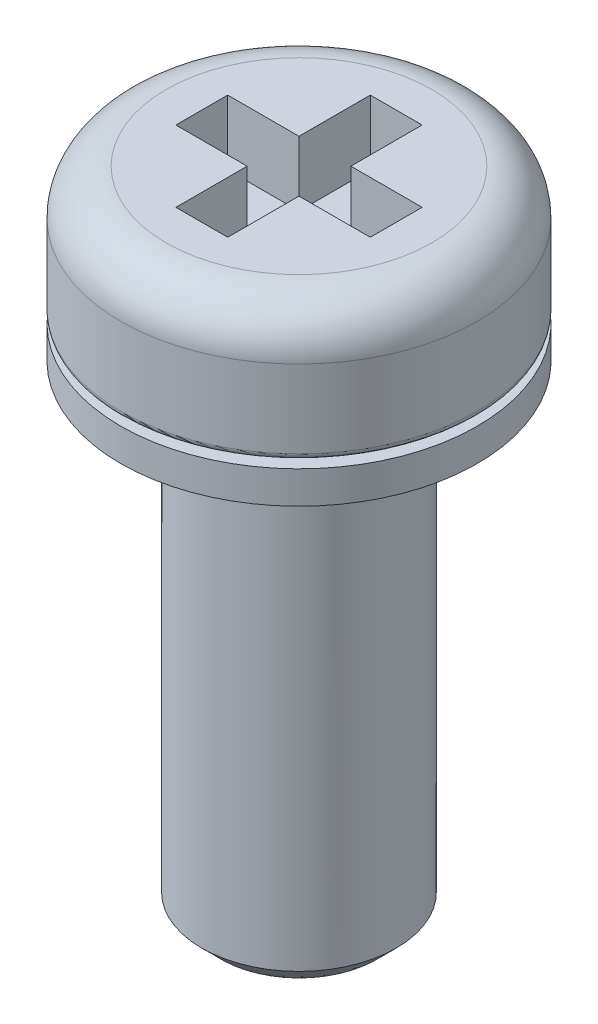
ISO-10303-21;
HEADER;
FILE_DESCRIPTION(('STEP AP214'),'2;1');
FILE_NAME('part.step','',(''),(''),'','','');
FILE_SCHEMA(('AUTOMOTIVE_DESIGN { 1 0 10303 214 1 1 1 1 }'));
ENDSEC;
DATA;
#1=APPLICATION_CONTEXT('core data for automotive mechanical design processes');
#2=APPLICATION_PROTOCOL_DEFINITION('international standard','automotive_design',2000,#1);
#3=PRODUCT_CONTEXT('',#1,'mechanical');
#4=PRODUCT('Part','Part','',(#3));
#5=PRODUCT_RELATED_PRODUCT_CATEGORY('part','',(#4));
#6=PRODUCT_DEFINITION_FORMATION('','',#4);
#7=PRODUCT_DEFINITION_CONTEXT('part definition',#1,'design');
#8=PRODUCT_DEFINITION('design','',#6,#7);
#9=PRODUCT_DEFINITION_SHAPE('','',#8);
#10=(LENGTH_UNIT() NAMED_UNIT(*) SI_UNIT(.MILLI.,.METRE.));
#11=(NAMED_UNIT(*) PLANE_ANGLE_UNIT() SI_UNIT($,.RADIAN.));
#12=(NAMED_UNIT(*) SI_UNIT($,.STERADIAN.) SOLID_ANGLE_UNIT());
#13=UNCERTAINTY_MEASURE_WITH_UNIT(LENGTH_MEASURE(1.E-05),#10,'distance_accuracy_value','');
#14=(GEOMETRIC_REPRESENTATION_CONTEXT(3) GLOBAL_UNCERTAINTY_ASSIGNED_CONTEXT((#13)) GLOBAL_UNIT_ASSIGNED_CONTEXT((#10,
#11,#12)) REPRESENTATION_CONTEXT('',''));
#15=CARTESIAN_POINT('',(0.,0.,0.));
#16=DIRECTION('',(0.,0.,1.));
#17=DIRECTION('',(1.,0.,0.));
#18=AXIS2_PLACEMENT_3D('',#15,#16,#17);
#19=CARTESIAN_POINT('',(-33.248,-7.4,44.74955299476));
#20=DIRECTION('',(0.,1.,0.));
#21=DIRECTION('',(1.,0.,0.));
#22=AXIS2_PLACEMENT_3D('',#19,#20,#21);
#23=PLANE('',#22);
#24=CARTESIAN_POINT('',(-32.,-7.40000000005466,43.5));
#25=DIRECTION('',(0.,1.,0.));
#26=DIRECTION('',(-1.,0.,0.));
#27=AXIS2_PLACEMENT_3D('',#24,#25,#26);
#28=CIRCLE('',#27,1.19999999995017);
#29=CARTESIAN_POINT('',(-33.1999999999502,-7.40000000005466,43.5));
#30=VERTEX_POINT('',#29);
#31=EDGE_CURVE('P0_E165',#30,#30,#28,.F.);
#32=ORIENTED_EDGE('',*,*,#31,.T.);
#33=EDGE_LOOP('',(#32));
#34=FACE_BOUND('',#33,.T.);
#35=ADVANCED_FACE('P0_F17',(#34),#23,.F.);
#36=CARTESIAN_POINT('',(-32.,-7.40000000005467,43.5));
#37=DIRECTION('',(0.,1.,0.));
#38=DIRECTION('',(-1.,0.,0.));
#39=AXIS2_PLACEMENT_3D('',#36,#37,#38);
#40=CONICAL_SURFACE('',#39,1.19999999995016,0.785398163389693);
#41=CARTESIAN_POINT('',(-32.,-7.09999999999999,43.5));
#42=DIRECTION('',(0.,1.,0.));
#43=DIRECTION('',(1.,0.,0.));
#44=AXIS2_PLACEMENT_3D('',#41,#42,#43);
#45=CIRCLE('',#44,1.5);
#46=CARTESIAN_POINT('',(-30.5,-7.09999999999999,43.5));
#47=VERTEX_POINT('',#46);
#48=EDGE_CURVE('P0_E161',#47,#47,#45,.F.);
#49=ORIENTED_EDGE('',*,*,#48,.T.);
#50=EDGE_LOOP('',(#49));
#51=FACE_BOUND('',#50,.T.);
#52=ORIENTED_EDGE('',*,*,#31,.F.);
#53=EDGE_LOOP('',(#52));
#54=FACE_BOUND('',#53,.T.);
#55=ADVANCED_FACE('P0_F537',(#51,#54),#40,.T.);
#56=CARTESIAN_POINT('',(-32.,-7.09999999999999,43.5));
#57=DIRECTION('',(0.,1.,0.));
#58=DIRECTION('',(0.,0.,1.));
#59=AXIS2_PLACEMENT_3D('',#56,#57,#58);
#60=CYLINDRICAL_SURFACE('',#59,1.5);
#61=CARTESIAN_POINT('',(-32.,3.55618312575245E-13,43.5));
#62=DIRECTION('',(0.,1.,0.));
#63=DIRECTION('',(0.,0.,1.));
#64=AXIS2_PLACEMENT_3D('',#61,#62,#63);
#65=CIRCLE('',#64,1.5);
#66=CARTESIAN_POINT('',(-32.,3.55618312575245E-13,45.));
#67=VERTEX_POINT('',#66);
#68=EDGE_CURVE('P0_E164',#67,#67,#65,.F.);
#69=ORIENTED_EDGE('',*,*,#68,.T.);
#70=EDGE_LOOP('',(#69));
#71=FACE_BOUND('',#70,.T.);
#72=ORIENTED_EDGE('',*,*,#48,.F.);
#73=EDGE_LOOP('',(#72));
#74=FACE_BOUND('',#73,.T.);
#75=ADVANCED_FACE('P0_F527',(#71,#74),#60,.T.);
#76=CARTESIAN_POINT('',(-34.86,0.,46.36));
#77=DIRECTION('',(0.,1.,0.));
#78=DIRECTION('',(1.,0.,0.));
#79=AXIS2_PLACEMENT_3D('',#76,#77,#78);
#80=PLANE('',#79);
#81=ORIENTED_EDGE('',*,*,#68,.F.);
#82=EDGE_LOOP('',(#81));
#83=FACE_BOUND('',#82,.T.);
#84=CARTESIAN_POINT('',(-32.,0.,43.5));
#85=DIRECTION('',(0.,1.,0.));
#86=DIRECTION('',(0.,0.,1.));
#87=AXIS2_PLACEMENT_3D('',#84,#85,#86);
#88=CIRCLE('',#87,2.75);
#89=CARTESIAN_POINT('',(-32.,0.,46.25));
#90=VERTEX_POINT('',#89);
#91=EDGE_CURVE('P0_E219',#90,#90,#88,.F.);
#92=ORIENTED_EDGE('',*,*,#91,.T.);
#93=EDGE_LOOP('',(#92));
#94=FACE_BOUND('',#93,.T.);
#95=ADVANCED_FACE('P0_F517',(#83,#94),#80,.F.);
#96=CARTESIAN_POINT('',(-32.,0.,43.5));
#97=DIRECTION('',(0.,1.,0.));
#98=DIRECTION('',(0.,0.,1.));
#99=AXIS2_PLACEMENT_3D('',#96,#97,#98);
#100=CYLINDRICAL_SURFACE('',#99,2.75);
#101=ORIENTED_EDGE('',*,*,#91,.F.);
#102=EDGE_LOOP('',(#101));
#103=FACE_BOUND('',#102,.T.);
#104=CARTESIAN_POINT('',(-32.,0.499999999999966,43.5));
#105=DIRECTION('',(0.,1.,0.));
#106=DIRECTION('',(0.,0.,1.));
#107=AXIS2_PLACEMENT_3D('',#104,#105,#106);
#108=CIRCLE('',#107,2.75);
#109=CARTESIAN_POINT('',(-32.,0.499999999999966,46.25));
#110=VERTEX_POINT('',#109);
#111=EDGE_CURVE('P0_E216',#110,#110,#108,.T.);
#112=ORIENTED_EDGE('',*,*,#111,.F.);
#113=EDGE_LOOP('',(#112));
#114=FACE_BOUND('',#113,.T.);
#115=ADVANCED_FACE('P0_F507',(#103,#114),#100,.T.);
#116=CARTESIAN_POINT('',(-34.86,0.5,46.36));
#117=DIRECTION('',(0.,1.,0.));
#118=DIRECTION('',(1.,0.,0.));
#119=AXIS2_PLACEMENT_3D('',#116,#117,#118);
#120=PLANE('',#119);
#121=CARTESIAN_POINT('',(-32.,0.499999999999853,43.5));
#122=DIRECTION('',(0.,1.,0.));
#123=DIRECTION('',(0.,0.,1.));
#124=AXIS2_PLACEMENT_3D('',#121,#122,#123);
#125=CIRCLE('',#124,1.5);
#126=CARTESIAN_POINT('',(-32.,0.499999999999853,45.));
#127=VERTEX_POINT('',#126);
#128=EDGE_CURVE('P0_E143',#127,#127,#125,.F.);
#129=ORIENTED_EDGE('',*,*,#128,.T.);
#130=EDGE_LOOP('',(#129));
#131=FACE_BOUND('',#130,.T.);
#132=ORIENTED_EDGE('',*,*,#111,.T.);
#133=EDGE_LOOP('',(#132));
#134=FACE_BOUND('',#133,.T.);
#135=ADVANCED_FACE('P0_F498',(#131,#134),#120,.T.);
#136=CARTESIAN_POINT('',(-30.44,1.6,45.06));
#137=DIRECTION('',(0.,1.,0.));
#138=DIRECTION('',(0.,0.,-1.));
#139=AXIS2_PLACEMENT_3D('',#136,#137,#138);
#140=PLANE('',#139);
#141=DIRECTION('',(-1.,0.,0.));
#142=VECTOR('',#141,1.);
#143=CARTESIAN_POINT('',(-32.95,1.6,43.1));
#144=LINE('',#143,#142);
#145=CARTESIAN_POINT('',(-32.4,1.6,43.1));
#146=VERTEX_POINT('',#145);
#147=CARTESIAN_POINT('',(-33.5,1.6,43.1));
#148=VERTEX_POINT('',#147);
#149=EDGE_CURVE('P0_E150',#146,#148,#144,.T.);
#150=ORIENTED_EDGE('',*,*,#149,.T.);
#151=DIRECTION('',(0.,0.,1.));
#152=VECTOR('',#151,1.);
#153=CARTESIAN_POINT('',(-33.5,1.6,43.5));
#154=LINE('',#153,#152);
#155=CARTESIAN_POINT('',(-33.5,1.6,43.9));
#156=VERTEX_POINT('',#155);
#157=EDGE_CURVE('P0_E142',#148,#156,#154,.T.);
#158=ORIENTED_EDGE('',*,*,#157,.T.);
#159=DIRECTION('',(1.,0.,0.));
#160=VECTOR('',#159,1.);
#161=CARTESIAN_POINT('',(-32.95,1.6,43.9));
#162=LINE('',#161,#160);
#163=CARTESIAN_POINT('',(-32.4,1.6,43.9));
#164=VERTEX_POINT('',#163);
#165=EDGE_CURVE('P0_E131',#156,#164,#162,.T.);
#166=ORIENTED_EDGE('',*,*,#165,.T.);
#167=DIRECTION('',(0.,0.,1.));
#168=VECTOR('',#167,1.);
#169=CARTESIAN_POINT('',(-32.4,1.6,44.45));
#170=LINE('',#169,#168);
#171=CARTESIAN_POINT('',(-32.4,1.6,45.));
#172=VERTEX_POINT('',#171);
#173=EDGE_CURVE('P0_E290',#164,#172,#170,.T.);
#174=ORIENTED_EDGE('',*,*,#173,.T.);
#175=DIRECTION('',(1.,0.,0.));
#176=VECTOR('',#175,1.);
#177=CARTESIAN_POINT('',(-32.,1.6,45.));
#178=LINE('',#177,#176);
#179=CARTESIAN_POINT('',(-31.6,1.6,45.));
#180=VERTEX_POINT('',#179);
#181=EDGE_CURVE('P0_E296',#172,#180,#178,.T.);
#182=ORIENTED_EDGE('',*,*,#181,.T.);
#183=DIRECTION('',(0.,0.,-1.));
#184=VECTOR('',#183,1.);
#185=CARTESIAN_POINT('',(-31.6,1.6,44.45));
#186=LINE('',#185,#184);
#187=CARTESIAN_POINT('',(-31.6,1.6,43.9));
#188=VERTEX_POINT('',#187);
#189=EDGE_CURVE('P0_E302',#180,#188,#186,.T.);
#190=ORIENTED_EDGE('',*,*,#189,.T.);
#191=DIRECTION('',(1.,0.,0.));
#192=VECTOR('',#191,1.);
#193=CARTESIAN_POINT('',(-31.05,1.6,43.9));
#194=LINE('',#193,#192);
#195=CARTESIAN_POINT('',(-30.5,1.6,43.9));
#196=VERTEX_POINT('',#195);
#197=EDGE_CURVE('P0_E308',#188,#196,#194,.T.);
#198=ORIENTED_EDGE('',*,*,#197,.T.);
#199=DIRECTION('',(0.,0.,-1.));
#200=VECTOR('',#199,1.);
#201=CARTESIAN_POINT('',(-30.5,1.6,43.5));
#202=LINE('',#201,#200);
#203=CARTESIAN_POINT('',(-30.5,1.6,43.1));
#204=VERTEX_POINT('',#203);
#205=EDGE_CURVE('P0_E314',#196,#204,#202,.T.);
#206=ORIENTED_EDGE('',*,*,#205,.T.);
#207=DIRECTION('',(-1.,0.,0.));
#208=VECTOR('',#207,1.);
#209=CARTESIAN_POINT('',(-31.05,1.6,43.1));
#210=LINE('',#209,#208);
#211=CARTESIAN_POINT('',(-31.6,1.6,43.1));
#212=VERTEX_POINT('',#211);
#213=EDGE_CURVE('P0_E320',#204,#212,#210,.T.);
#214=ORIENTED_EDGE('',*,*,#213,.T.);
#215=DIRECTION('',(0.,0.,-1.));
#216=VECTOR('',#215,1.);
#217=CARTESIAN_POINT('',(-31.6,1.6,42.55));
#218=LINE('',#217,#216);
#219=CARTESIAN_POINT('',(-31.6,1.6,42.));
#220=VERTEX_POINT('',#219);
#221=EDGE_CURVE('P0_E326',#212,#220,#218,.T.);
#222=ORIENTED_EDGE('',*,*,#221,.T.);
#223=DIRECTION('',(-1.,0.,0.));
#224=VECTOR('',#223,1.);
#225=CARTESIAN_POINT('',(-32.,1.6,42.));
#226=LINE('',#225,#224);
#227=CARTESIAN_POINT('',(-32.4,1.6,42.));
#228=VERTEX_POINT('',#227);
#229=EDGE_CURVE('P0_E332',#220,#228,#226,.T.);
#230=ORIENTED_EDGE('',*,*,#229,.T.);
#231=DIRECTION('',(0.,0.,1.));
#232=VECTOR('',#231,1.);
#233=CARTESIAN_POINT('',(-32.4,1.6,42.55));
#234=LINE('',#233,#232);
#235=EDGE_CURVE('P0_E338',#228,#146,#234,.T.);
#236=ORIENTED_EDGE('',*,*,#235,.T.);
#237=EDGE_LOOP('',(#150,#158,#166,#174,#182,#190,#198,#206,#214,#222,#230,#236));
#238=FACE_BOUND('',#237,.T.);
#239=ADVANCED_FACE('P0_F153',(#238),#140,.T.);
#240=CARTESIAN_POINT('',(-32.,0.499999999999853,43.5));
#241=DIRECTION('',(0.,1.,0.));
#242=DIRECTION('',(0.,0.,1.));
#243=AXIS2_PLACEMENT_3D('',#240,#241,#242);
#244=CYLINDRICAL_SURFACE('',#243,1.5);
#245=CARTESIAN_POINT('',(-32.,0.599999999999755,43.5));
#246=DIRECTION('',(0.,1.,0.));
#247=DIRECTION('',(0.,0.,1.));
#248=AXIS2_PLACEMENT_3D('',#245,#246,#247);
#249=CIRCLE('',#248,1.5);
#250=CARTESIAN_POINT('',(-32.,0.599999999999755,45.));
#251=VERTEX_POINT('',#250);
#252=EDGE_CURVE('P0_E206',#251,#251,#249,.F.);
#253=ORIENTED_EDGE('',*,*,#252,.T.);
#254=EDGE_LOOP('',(#253));
#255=FACE_BOUND('',#254,.T.);
#256=ORIENTED_EDGE('',*,*,#128,.F.);
#257=EDGE_LOOP('',(#256));
#258=FACE_BOUND('',#257,.T.);
#259=ADVANCED_FACE('P0_F481',(#255,#258),#244,.T.);
#260=CARTESIAN_POINT('',(-33.522,1.58,43.9));
#261=DIRECTION('',(0.,0.,1.));
#262=DIRECTION('',(1.,0.,0.));
#263=AXIS2_PLACEMENT_3D('',#260,#261,#262);
#264=PLANE('',#263);
#265=ORIENTED_EDGE('',*,*,#165,.F.);
#266=DIRECTION('',(0.,1.,0.));
#267=VECTOR('',#266,1.);
#268=CARTESIAN_POINT('',(-33.5,2.1,43.9));
#269=LINE('',#268,#267);
#270=CARTESIAN_POINT('',(-33.5,2.6,43.9));
#271=VERTEX_POINT('',#270);
#272=EDGE_CURVE('P0_E135',#156,#271,#269,.T.);
#273=ORIENTED_EDGE('',*,*,#272,.T.);
#274=DIRECTION('',(-1.,0.,0.));
#275=VECTOR('',#274,1.);
#276=CARTESIAN_POINT('',(-32.,2.6,43.9000000000002));
#277=LINE('',#276,#275);
#278=CARTESIAN_POINT('',(-32.4,2.6,43.9));
#279=VERTEX_POINT('',#278);
#280=EDGE_CURVE('P0_E269',#279,#271,#277,.T.);
#281=ORIENTED_EDGE('',*,*,#280,.F.);
#282=DIRECTION('',(0.,-1.,0.));
#283=VECTOR('',#282,1.);
#284=CARTESIAN_POINT('',(-32.4,2.1,43.9));
#285=LINE('',#284,#283);
#286=EDGE_CURVE('P0_E137',#279,#164,#285,.T.);
#287=ORIENTED_EDGE('',*,*,#286,.T.);
#288=EDGE_LOOP('',(#265,#273,#281,#287));
#289=FACE_BOUND('',#288,.T.);
#290=ADVANCED_FACE('P0_F133',(#289),#264,.F.);
#291=CARTESIAN_POINT('',(-33.5,1.58,43.084));
#292=DIRECTION('',(-1.,0.,0.));
#293=DIRECTION('',(0.,0.,1.));
#294=AXIS2_PLACEMENT_3D('',#291,#292,#293);
#295=PLANE('',#294);
#296=ORIENTED_EDGE('',*,*,#157,.F.);
#297=DIRECTION('',(0.,1.,0.));
#298=VECTOR('',#297,1.);
#299=CARTESIAN_POINT('',(-33.5,2.1,43.1));
#300=LINE('',#299,#298);
#301=CARTESIAN_POINT('',(-33.5,2.6,43.0999999999999));
#302=VERTEX_POINT('',#301);
#303=EDGE_CURVE('P0_E340',#148,#302,#300,.T.);
#304=ORIENTED_EDGE('',*,*,#303,.T.);
#305=DIRECTION('',(0.,0.,-1.));
#306=VECTOR('',#305,1.);
#307=CARTESIAN_POINT('',(-33.5,2.6,43.5));
#308=LINE('',#307,#306);
#309=EDGE_CURVE('P0_E149',#271,#302,#308,.T.);
#310=ORIENTED_EDGE('',*,*,#309,.F.);
#311=ORIENTED_EDGE('',*,*,#272,.F.);
#312=EDGE_LOOP('',(#296,#304,#310,#311));
#313=FACE_BOUND('',#312,.T.);
#314=ADVANCED_FACE('P0_F146',(#313),#295,.F.);
#315=CARTESIAN_POINT('',(-32.378,1.58,43.1));
#316=DIRECTION('',(0.,0.,-1.));
#317=DIRECTION('',(-1.,0.,0.));
#318=AXIS2_PLACEMENT_3D('',#315,#316,#317);
#319=PLANE('',#318);
#320=ORIENTED_EDGE('',*,*,#149,.F.);
#321=DIRECTION('',(0.,1.,0.));
#322=VECTOR('',#321,1.);
#323=CARTESIAN_POINT('',(-32.4,2.1,43.1));
#324=LINE('',#323,#322);
#325=CARTESIAN_POINT('',(-32.4,2.6,43.0999999999999));
#326=VERTEX_POINT('',#325);
#327=EDGE_CURVE('P0_E335',#146,#326,#324,.T.);
#328=ORIENTED_EDGE('',*,*,#327,.T.);
#329=DIRECTION('',(1.,0.,0.));
#330=VECTOR('',#329,1.);
#331=CARTESIAN_POINT('',(-32.,2.6,43.0999999999998));
#332=LINE('',#331,#330);
#333=EDGE_CURVE('P0_E266',#302,#326,#332,.T.);
#334=ORIENTED_EDGE('',*,*,#333,.F.);
#335=ORIENTED_EDGE('',*,*,#303,.F.);
#336=EDGE_LOOP('',(#320,#328,#334,#335));
#337=FACE_BOUND('',#336,.T.);
#338=ADVANCED_FACE('P0_F343',(#337),#319,.F.);
#339=CARTESIAN_POINT('',(-32.4,1.58,41.978));
#340=DIRECTION('',(-1.,0.,0.));
#341=DIRECTION('',(0.,0.,1.));
#342=AXIS2_PLACEMENT_3D('',#339,#340,#341);
#343=PLANE('',#342);
#344=ORIENTED_EDGE('',*,*,#235,.F.);
#345=DIRECTION('',(0.,1.,0.));
#346=VECTOR('',#345,1.);
#347=CARTESIAN_POINT('',(-32.4,2.1,42.));
#348=LINE('',#347,#346);
#349=CARTESIAN_POINT('',(-32.4,2.6,41.9999999999998));
#350=VERTEX_POINT('',#349);
#351=EDGE_CURVE('P0_E329',#228,#350,#348,.T.);
#352=ORIENTED_EDGE('',*,*,#351,.T.);
#353=DIRECTION('',(0.,0.,-1.));
#354=VECTOR('',#353,1.);
#355=CARTESIAN_POINT('',(-32.4,2.6,43.5));
#356=LINE('',#355,#354);
#357=EDGE_CURVE('P0_E264',#326,#350,#356,.T.);
#358=ORIENTED_EDGE('',*,*,#357,.F.);
#359=ORIENTED_EDGE('',*,*,#327,.F.);
#360=EDGE_LOOP('',(#344,#352,#358,#359));
#361=FACE_BOUND('',#360,.T.);
#362=ADVANCED_FACE('P0_F377',(#361),#343,.F.);
#363=CARTESIAN_POINT('',(-31.584,1.58,42.));
#364=DIRECTION('',(0.,0.,-1.));
#365=DIRECTION('',(-1.,0.,0.));
#366=AXIS2_PLACEMENT_3D('',#363,#364,#365);
#367=PLANE('',#366);
#368=ORIENTED_EDGE('',*,*,#229,.F.);
#369=DIRECTION('',(0.,1.,0.));
#370=VECTOR('',#369,1.);
#371=CARTESIAN_POINT('',(-31.6,2.1,42.));
#372=LINE('',#371,#370);
#373=CARTESIAN_POINT('',(-31.6,2.6,41.9999999999998));
#374=VERTEX_POINT('',#373);
#375=EDGE_CURVE('P0_E323',#220,#374,#372,.T.);
#376=ORIENTED_EDGE('',*,*,#375,.T.);
#377=DIRECTION('',(1.,0.,0.));
#378=VECTOR('',#377,1.);
#379=CARTESIAN_POINT('',(-32.,2.6,41.9999999999993));
#380=LINE('',#379,#378);
#381=EDGE_CURVE('P0_E262',#350,#374,#380,.T.);
#382=ORIENTED_EDGE('',*,*,#381,.F.);
#383=ORIENTED_EDGE('',*,*,#351,.F.);
#384=EDGE_LOOP('',(#368,#376,#382,#383));
#385=FACE_BOUND('',#384,.T.);
#386=ADVANCED_FACE('P0_F374',(#385),#367,.F.);
#387=CARTESIAN_POINT('',(-31.6,1.58,43.122));
#388=DIRECTION('',(1.,0.,0.));
#389=DIRECTION('',(0.,0.,-1.));
#390=AXIS2_PLACEMENT_3D('',#387,#388,#389);
#391=PLANE('',#390);
#392=ORIENTED_EDGE('',*,*,#221,.F.);
#393=DIRECTION('',(0.,1.,0.));
#394=VECTOR('',#393,1.);
#395=CARTESIAN_POINT('',(-31.6,2.1,43.1));
#396=LINE('',#395,#394);
#397=CARTESIAN_POINT('',(-31.6,2.6,43.0999999999999));
#398=VERTEX_POINT('',#397);
#399=EDGE_CURVE('P0_E317',#212,#398,#396,.T.);
#400=ORIENTED_EDGE('',*,*,#399,.T.);
#401=DIRECTION('',(0.,0.,1.));
#402=VECTOR('',#401,1.);
#403=CARTESIAN_POINT('',(-31.6,2.6,43.5));
#404=LINE('',#403,#402);
#405=EDGE_CURVE('P0_E260',#374,#398,#404,.T.);
#406=ORIENTED_EDGE('',*,*,#405,.F.);
#407=ORIENTED_EDGE('',*,*,#375,.F.);
#408=EDGE_LOOP('',(#392,#400,#406,#407));
#409=FACE_BOUND('',#408,.T.);
#410=ADVANCED_FACE('P0_F370',(#409),#391,.F.);
#411=CARTESIAN_POINT('',(-30.478,1.58,43.1));
#412=DIRECTION('',(0.,0.,-1.));
#413=DIRECTION('',(-1.,0.,0.));
#414=AXIS2_PLACEMENT_3D('',#411,#412,#413);
#415=PLANE('',#414);
#416=ORIENTED_EDGE('',*,*,#213,.F.);
#417=DIRECTION('',(0.,1.,0.));
#418=VECTOR('',#417,1.);
#419=CARTESIAN_POINT('',(-30.5,2.1,43.1));
#420=LINE('',#419,#418);
#421=CARTESIAN_POINT('',(-30.5,2.6,43.0999999999999));
#422=VERTEX_POINT('',#421);
#423=EDGE_CURVE('P0_E311',#204,#422,#420,.T.);
#424=ORIENTED_EDGE('',*,*,#423,.T.);
#425=DIRECTION('',(1.,0.,0.));
#426=VECTOR('',#425,1.);
#427=CARTESIAN_POINT('',(-32.,2.6,43.0999999999998));
#428=LINE('',#427,#426);
#429=EDGE_CURVE('P0_E258',#398,#422,#428,.T.);
#430=ORIENTED_EDGE('',*,*,#429,.F.);
#431=ORIENTED_EDGE('',*,*,#399,.F.);
#432=EDGE_LOOP('',(#416,#424,#430,#431));
#433=FACE_BOUND('',#432,.T.);
#434=ADVANCED_FACE('P0_F366',(#433),#415,.F.);
#435=CARTESIAN_POINT('',(-30.5,1.58,43.916));
#436=DIRECTION('',(1.,0.,0.));
#437=DIRECTION('',(0.,0.,-1.));
#438=AXIS2_PLACEMENT_3D('',#435,#436,#437);
#439=PLANE('',#438);
#440=ORIENTED_EDGE('',*,*,#205,.F.);
#441=DIRECTION('',(0.,1.,0.));
#442=VECTOR('',#441,1.);
#443=CARTESIAN_POINT('',(-30.5,2.1,43.9));
#444=LINE('',#443,#442);
#445=CARTESIAN_POINT('',(-30.5,2.6,43.9));
#446=VERTEX_POINT('',#445);
#447=EDGE_CURVE('P0_E305',#196,#446,#444,.T.);
#448=ORIENTED_EDGE('',*,*,#447,.T.);
#449=DIRECTION('',(0.,0.,1.));
#450=VECTOR('',#449,1.);
#451=CARTESIAN_POINT('',(-30.5,2.6,43.5));
#452=LINE('',#451,#450);
#453=EDGE_CURVE('P0_E256',#422,#446,#452,.T.);
#454=ORIENTED_EDGE('',*,*,#453,.F.);
#455=ORIENTED_EDGE('',*,*,#423,.F.);
#456=EDGE_LOOP('',(#440,#448,#454,#455));
#457=FACE_BOUND('',#456,.T.);
#458=ADVANCED_FACE('P0_F362',(#457),#439,.F.);
#459=CARTESIAN_POINT('',(-31.622,1.58,43.9));
#460=DIRECTION('',(0.,0.,1.));
#461=DIRECTION('',(1.,0.,0.));
#462=AXIS2_PLACEMENT_3D('',#459,#460,#461);
#463=PLANE('',#462);
#464=ORIENTED_EDGE('',*,*,#197,.F.);
#465=DIRECTION('',(0.,1.,0.));
#466=VECTOR('',#465,1.);
#467=CARTESIAN_POINT('',(-31.6,2.1,43.9));
#468=LINE('',#467,#466);
#469=CARTESIAN_POINT('',(-31.6,2.6,43.9));
#470=VERTEX_POINT('',#469);
#471=EDGE_CURVE('P0_E299',#188,#470,#468,.T.);
#472=ORIENTED_EDGE('',*,*,#471,.T.);
#473=DIRECTION('',(-1.,0.,0.));
#474=VECTOR('',#473,1.);
#475=CARTESIAN_POINT('',(-32.,2.6,43.9000000000002));
#476=LINE('',#475,#474);
#477=EDGE_CURVE('P0_E254',#446,#470,#476,.T.);
#478=ORIENTED_EDGE('',*,*,#477,.F.);
#479=ORIENTED_EDGE('',*,*,#447,.F.);
#480=EDGE_LOOP('',(#464,#472,#478,#479));
#481=FACE_BOUND('',#480,.T.);
#482=ADVANCED_FACE('P0_F358',(#481),#463,.F.);
#483=CARTESIAN_POINT('',(-31.6,1.58,45.022));
#484=DIRECTION('',(1.,0.,0.));
#485=DIRECTION('',(0.,0.,-1.));
#486=AXIS2_PLACEMENT_3D('',#483,#484,#485);
#487=PLANE('',#486);
#488=ORIENTED_EDGE('',*,*,#189,.F.);
#489=DIRECTION('',(0.,1.,0.));
#490=VECTOR('',#489,1.);
#491=CARTESIAN_POINT('',(-31.6,2.1,45.));
#492=LINE('',#491,#490);
#493=CARTESIAN_POINT('',(-31.6,2.6,45.0000000000002));
#494=VERTEX_POINT('',#493);
#495=EDGE_CURVE('P0_E293',#180,#494,#492,.T.);
#496=ORIENTED_EDGE('',*,*,#495,.T.);
#497=DIRECTION('',(0.,0.,1.));
#498=VECTOR('',#497,1.);
#499=CARTESIAN_POINT('',(-31.6,2.6,43.5));
#500=LINE('',#499,#498);
#501=EDGE_CURVE('P0_E252',#470,#494,#500,.T.);
#502=ORIENTED_EDGE('',*,*,#501,.F.);
#503=ORIENTED_EDGE('',*,*,#471,.F.);
#504=EDGE_LOOP('',(#488,#496,#502,#503));
#505=FACE_BOUND('',#504,.T.);
#506=ADVANCED_FACE('P0_F354',(#505),#487,.F.);
#507=CARTESIAN_POINT('',(-32.416,1.58,45.));
#508=DIRECTION('',(0.,0.,1.));
#509=DIRECTION('',(1.,0.,0.));
#510=AXIS2_PLACEMENT_3D('',#507,#508,#509);
#511=PLANE('',#510);
#512=ORIENTED_EDGE('',*,*,#181,.F.);
#513=DIRECTION('',(0.,1.,0.));
#514=VECTOR('',#513,1.);
#515=CARTESIAN_POINT('',(-32.4,2.1,45.));
#516=LINE('',#515,#514);
#517=CARTESIAN_POINT('',(-32.4,2.6,45.0000000000002));
#518=VERTEX_POINT('',#517);
#519=EDGE_CURVE('P0_E283',#172,#518,#516,.T.);
#520=ORIENTED_EDGE('',*,*,#519,.T.);
#521=DIRECTION('',(-1.,0.,0.));
#522=VECTOR('',#521,1.);
#523=CARTESIAN_POINT('',(-32.,2.6,45.0000000000007));
#524=LINE('',#523,#522);
#525=EDGE_CURVE('P0_E60',#494,#518,#524,.T.);
#526=ORIENTED_EDGE('',*,*,#525,.F.);
#527=ORIENTED_EDGE('',*,*,#495,.F.);
#528=EDGE_LOOP('',(#512,#520,#526,#527));
#529=FACE_BOUND('',#528,.T.);
#530=ADVANCED_FACE('P0_F351',(#529),#511,.F.);
#531=CARTESIAN_POINT('',(-32.4,1.58,43.878));
#532=DIRECTION('',(-1.,0.,0.));
#533=DIRECTION('',(0.,0.,1.));
#534=AXIS2_PLACEMENT_3D('',#531,#532,#533);
#535=PLANE('',#534);
#536=ORIENTED_EDGE('',*,*,#173,.F.);
#537=ORIENTED_EDGE('',*,*,#286,.F.);
#538=DIRECTION('',(0.,0.,-1.));
#539=VECTOR('',#538,1.);
#540=CARTESIAN_POINT('',(-32.4,2.6,43.5));
#541=LINE('',#540,#539);
#542=EDGE_CURVE('P0_E249',#518,#279,#541,.T.);
#543=ORIENTED_EDGE('',*,*,#542,.F.);
#544=ORIENTED_EDGE('',*,*,#519,.F.);
#545=EDGE_LOOP('',(#536,#537,#543,#544));
#546=FACE_BOUND('',#545,.T.);
#547=ADVANCED_FACE('P0_F180',(#546),#535,.F.);
#548=CARTESIAN_POINT('',(-34.756,0.6,46.256));
#549=DIRECTION('',(0.,1.,0.));
#550=DIRECTION('',(1.,0.,0.));
#551=AXIS2_PLACEMENT_3D('',#548,#549,#550);
#552=PLANE('',#551);
#553=ORIENTED_EDGE('',*,*,#252,.F.);
#554=EDGE_LOOP('',(#553));
#555=FACE_BOUND('',#554,.T.);
#556=CARTESIAN_POINT('',(-32.,0.6,43.5));
#557=DIRECTION('',(0.,1.,0.));
#558=DIRECTION('',(-1.,0.,-2.43515899269084E-13));
#559=AXIS2_PLACEMENT_3D('',#556,#557,#558);
#560=CIRCLE('',#559,2.65000000000123);
#561=CARTESIAN_POINT('',(-29.3499999999993,0.6,43.5000000000003));
#562=VERTEX_POINT('',#561);
#563=CARTESIAN_POINT('',(-34.6500000000007,0.6,43.4999999999999));
#564=VERTEX_POINT('',#563);
#565=EDGE_CURVE('P0_E167',#562,#564,#560,.F.);
#566=ORIENTED_EDGE('',*,*,#565,.T.);
#567=CARTESIAN_POINT('',(-32.,0.6,43.5));
#568=DIRECTION('',(0.,1.,0.));
#569=DIRECTION('',(1.,0.,2.48752800328634E-13));
#570=AXIS2_PLACEMENT_3D('',#567,#568,#569);
#571=CIRCLE('',#570,2.65000000000123);
#572=EDGE_CURVE('P0_E48',#562,#564,#571,.T.);
#573=ORIENTED_EDGE('',*,*,#572,.F.);
#574=EDGE_LOOP('',(#566,#573));
#575=FACE_BOUND('',#574,.T.);
#576=ADVANCED_FACE('P0_F171',(#555,#575),#552,.F.);
#577=CARTESIAN_POINT('',(-34.132,2.6,45.63413563585));
#578=DIRECTION('',(0.,1.,0.));
#579=DIRECTION('',(1.,0.,0.));
#580=AXIS2_PLACEMENT_3D('',#577,#578,#579);
#581=PLANE('',#580);
#582=ORIENTED_EDGE('',*,*,#525,.T.);
#583=ORIENTED_EDGE('',*,*,#542,.T.);
#584=ORIENTED_EDGE('',*,*,#280,.T.);
#585=ORIENTED_EDGE('',*,*,#309,.T.);
#586=ORIENTED_EDGE('',*,*,#333,.T.);
#587=ORIENTED_EDGE('',*,*,#357,.T.);
#588=ORIENTED_EDGE('',*,*,#381,.T.);
#589=ORIENTED_EDGE('',*,*,#405,.T.);
#590=ORIENTED_EDGE('',*,*,#429,.T.);
#591=ORIENTED_EDGE('',*,*,#453,.T.);
#592=ORIENTED_EDGE('',*,*,#477,.T.);
#593=ORIENTED_EDGE('',*,*,#501,.T.);
#594=EDGE_LOOP('',(#582,#583,#584,#585,#586,#587,#588,#589,#590,#591,#592,#593));
#595=FACE_BOUND('',#594,.T.);
#596=CARTESIAN_POINT('',(-32.,2.6,43.5));
#597=DIRECTION('',(0.,-1.,0.));
#598=DIRECTION('',(-1.,0.,2.40661149545627E-12));
#599=AXIS2_PLACEMENT_3D('',#596,#597,#598);
#600=CIRCLE('',#599,2.04999999999696);
#601=CARTESIAN_POINT('',(-29.9500000000018,2.6,43.4999999999972));
#602=VERTEX_POINT('',#601);
#603=CARTESIAN_POINT('',(-34.0499999999982,2.6,43.5000000000029));
#604=VERTEX_POINT('',#603);
#605=EDGE_CURVE('P0_E38',#602,#604,#600,.F.);
#606=ORIENTED_EDGE('',*,*,#605,.T.);
#607=CARTESIAN_POINT('',(-32.,2.6,43.5));
#608=DIRECTION('',(0.,-1.,0.));
#609=DIRECTION('',(1.,0.,-2.40322666916168E-12));
#610=AXIS2_PLACEMENT_3D('',#607,#608,#609);
#611=CIRCLE('',#610,2.04999999999696);
#612=EDGE_CURVE('P0_E160',#604,#602,#611,.F.);
#613=ORIENTED_EDGE('',*,*,#612,.T.);
#614=EDGE_LOOP('',(#606,#613));
#615=FACE_BOUND('',#614,.T.);
#616=ADVANCED_FACE('P0_F19',(#595,#615),#581,.T.);
#617=CARTESIAN_POINT('',(-32.,0.7,43.5));
#618=DIRECTION('',(0.,1.,0.));
#619=DIRECTION('',(0.999949372127837,0.,-0.010062463969809));
#620=AXIS2_PLACEMENT_3D('',#617,#618,#619);
#621=TOROIDAL_SURFACE('',#620,2.65000000000124,0.1);
#622=CARTESIAN_POINT('',(-32.,0.700000000000001,43.5));
#623=DIRECTION('',(0.,1.,0.));
#624=DIRECTION('',(1.,0.,0.));
#625=AXIS2_PLACEMENT_3D('',#622,#623,#624);
#626=CIRCLE('',#625,2.75);
#627=CARTESIAN_POINT('',(-29.25,0.700000000000001,43.5));
#628=VERTEX_POINT('',#627);
#629=EDGE_CURVE('P0_E30',#628,#628,#626,.F.);
#630=ORIENTED_EDGE('',*,*,#629,.T.);
#631=EDGE_LOOP('',(#630));
#632=FACE_BOUND('',#631,.T.);
#633=ORIENTED_EDGE('',*,*,#565,.F.);
#634=ORIENTED_EDGE('',*,*,#572,.T.);
#635=EDGE_LOOP('',(#633,#634));
#636=FACE_BOUND('',#635,.T.);
#637=ADVANCED_FACE('P0_F240',(#632,#636),#621,.T.);
#638=CARTESIAN_POINT('',(-32.,1.9,43.5));
#639=DIRECTION('',(0.,1.,0.));
#640=DIRECTION('',(0.999976804825838,0.,-0.00681100655610854));
#641=AXIS2_PLACEMENT_3D('',#638,#639,#640);
#642=TOROIDAL_SURFACE('',#641,2.04999999999703,0.7);
#643=ORIENTED_EDGE('',*,*,#605,.F.);
#644=ORIENTED_EDGE('',*,*,#612,.F.);
#645=EDGE_LOOP('',(#643,#644));
#646=FACE_BOUND('',#645,.T.);
#647=CARTESIAN_POINT('',(-32.,1.89999999999996,43.5));
#648=DIRECTION('',(0.,1.,0.));
#649=DIRECTION('',(1.,0.,0.));
#650=AXIS2_PLACEMENT_3D('',#647,#648,#649);
#651=CIRCLE('',#650,2.75);
#652=CARTESIAN_POINT('',(-29.25,1.89999999999996,43.5));
#653=VERTEX_POINT('',#652);
#654=EDGE_CURVE('P0_E11',#653,#653,#651,.T.);
#655=ORIENTED_EDGE('',*,*,#654,.T.);
#656=EDGE_LOOP('',(#655));
#657=FACE_BOUND('',#656,.T.);
#658=ADVANCED_FACE('P0_F229',(#646,#657),#642,.T.);
#659=CARTESIAN_POINT('',(-32.,0.700000000000001,43.5));
#660=DIRECTION('',(0.,1.,0.));
#661=DIRECTION('',(0.,0.,1.));
#662=AXIS2_PLACEMENT_3D('',#659,#660,#661);
#663=CYLINDRICAL_SURFACE('',#662,2.75);
#664=ORIENTED_EDGE('',*,*,#654,.F.);
#665=EDGE_LOOP('',(#664));
#666=FACE_BOUND('',#665,.T.);
#667=ORIENTED_EDGE('',*,*,#629,.F.);
#668=EDGE_LOOP('',(#667));
#669=FACE_BOUND('',#668,.T.);
#670=ADVANCED_FACE('P0_F239',(#666,#669),#663,.T.);
#671=CLOSED_SHELL('',(#35,#55,#75,#95,#115,#135,#239,#259,#290,#314,#338,#362,#386,#410,#434,
#458,#482,#506,#530,#547,#576,#616,#637,#658,#670));
#672=MANIFOLD_SOLID_BREP('P0_B1',#671);
#673=CARTESIAN_POINT('',(-32.,-7.34999999999999,43.5));
#674=DIRECTION('',(0.,1.,0.));
#675=DIRECTION('',(0.,0.,1.));
#676=AXIS2_PLACEMENT_3D('',#673,#674,#675);
#677=CYLINDRICAL_SURFACE('',#676,1.25);
#678=CARTESIAN_POINT('',(-32.,0.599999999999747,43.5));
#679=DIRECTION('',(0.,1.,0.));
#680=DIRECTION('',(-1.,0.,0.));
#681=AXIS2_PLACEMENT_3D('',#678,#679,#680);
#682=CIRCLE('',#681,1.25);
#683=CARTESIAN_POINT('',(-33.25,0.599999999999747,43.5));
#684=VERTEX_POINT('',#683);
#685=EDGE_CURVE('P1_E10',#684,#684,#682,.T.);
#686=ORIENTED_EDGE('',*,*,#685,.T.);
#687=EDGE_LOOP('',(#686));
#688=FACE_BOUND('',#687,.T.);
#689=CARTESIAN_POINT('',(-32.,-7.34999999999999,43.5));
#690=DIRECTION('',(0.,1.,0.));
#691=DIRECTION('',(-1.,0.,0.));
#692=AXIS2_PLACEMENT_3D('',#689,#690,#691);
#693=CIRCLE('',#692,1.24999999999999);
#694=CARTESIAN_POINT('',(-33.25,-7.34999999999999,43.5));
#695=VERTEX_POINT('',#694);
#696=EDGE_CURVE('P1_E16',#695,#695,#693,.F.);
#697=ORIENTED_EDGE('',*,*,#696,.T.);
#698=EDGE_LOOP('',(#697));
#699=FACE_BOUND('',#698,.T.);
#700=ADVANCED_FACE('P1_F15',(#688,#699),#677,.F.);
#701=OPEN_SHELL('',(#700));
#702=SHELL_BASED_SURFACE_MODEL('P1_B1',(#701));
#703=ADVANCED_BREP_SHAPE_REPRESENTATION('',(#18,#672),#14);
#704=MANIFOLD_SURFACE_SHAPE_REPRESENTATION('',(#18,#702),#14);
#705=SHAPE_REPRESENTATION('',(#18),#14);
#706=SHAPE_DEFINITION_REPRESENTATION(#9,#705);
#707=SHAPE_REPRESENTATION_RELATIONSHIP('','',#705,#703);
#708=SHAPE_REPRESENTATION_RELATIONSHIP('','',#705,#704);
ENDSEC;
END-ISO-10303-21;
